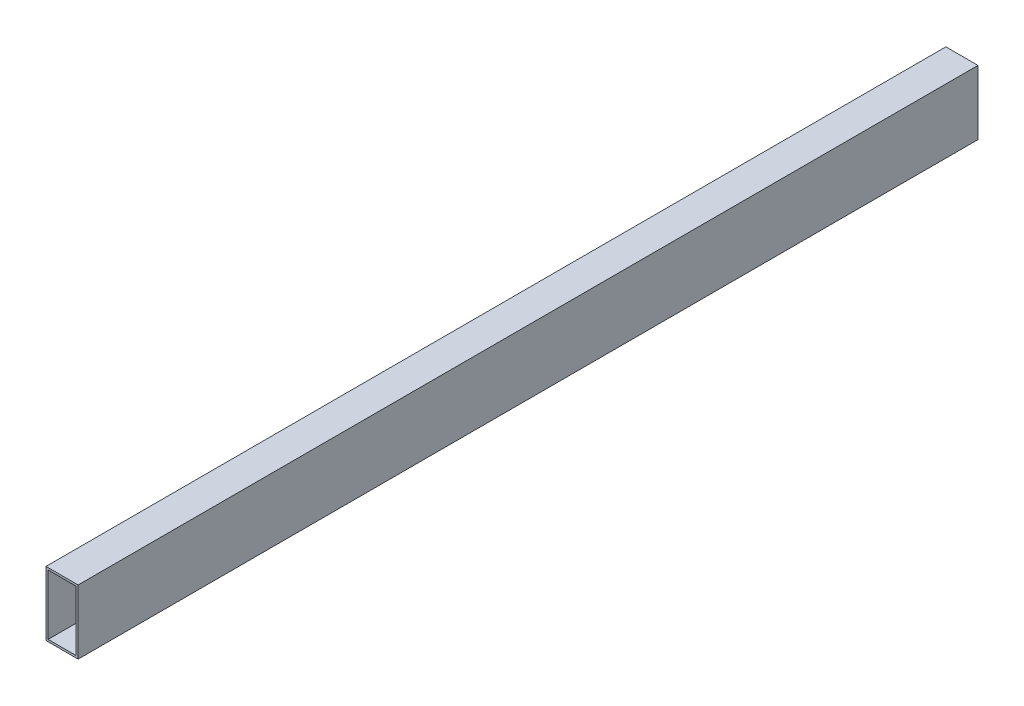
ISO-10303-21;
HEADER;
FILE_DESCRIPTION(('STEP AP214'),'2;1');
FILE_NAME('part.step','',(''),(''),'','','');
FILE_SCHEMA(('AUTOMOTIVE_DESIGN { 1 0 10303 214 1 1 1 1 }'));
ENDSEC;
DATA;
#1=APPLICATION_CONTEXT('core data for automotive mechanical design processes');
#2=APPLICATION_PROTOCOL_DEFINITION('international standard','automotive_design',2000,#1);
#3=PRODUCT_CONTEXT('',#1,'mechanical');
#4=PRODUCT('Part','Part','',(#3));
#5=PRODUCT_RELATED_PRODUCT_CATEGORY('part','',(#4));
#6=PRODUCT_DEFINITION_FORMATION('','',#4);
#7=PRODUCT_DEFINITION_CONTEXT('part definition',#1,'design');
#8=PRODUCT_DEFINITION('design','',#6,#7);
#9=PRODUCT_DEFINITION_SHAPE('','',#8);
#10=(LENGTH_UNIT() NAMED_UNIT(*) SI_UNIT(.MILLI.,.METRE.));
#11=(NAMED_UNIT(*) PLANE_ANGLE_UNIT() SI_UNIT($,.RADIAN.));
#12=(NAMED_UNIT(*) SI_UNIT($,.STERADIAN.) SOLID_ANGLE_UNIT());
#13=UNCERTAINTY_MEASURE_WITH_UNIT(LENGTH_MEASURE(1.E-05),#10,'distance_accuracy_value','');
#14=(GEOMETRIC_REPRESENTATION_CONTEXT(3) GLOBAL_UNCERTAINTY_ASSIGNED_CONTEXT((#13)) GLOBAL_UNIT_ASSIGNED_CONTEXT((#10,
#11,#12)) REPRESENTATION_CONTEXT('',''));
#15=CARTESIAN_POINT('',(0.,0.,0.));
#16=DIRECTION('',(0.,0.,1.));
#17=DIRECTION('',(1.,0.,0.));
#18=AXIS2_PLACEMENT_3D('',#15,#16,#17);
#19=CARTESIAN_POINT('',(-48.4372093023255,-30.1994186046511,711.2));
#20=DIRECTION('',(1.,0.,0.));
#21=DIRECTION('',(0.,0.,-1.));
#22=AXIS2_PLACEMENT_3D('',#19,#20,#21);
#23=PLANE('',#22);
#24=DIRECTION('',(0.,-1.,0.));
#25=VECTOR('',#24,1.);
#26=CARTESIAN_POINT('',(-48.4372093023255,-30.1994186046511,0.));
#27=LINE('',#26,#25);
#28=CARTESIAN_POINT('',(-48.4372093023255,20.6005813953489,0.));
#29=VERTEX_POINT('',#28);
#30=CARTESIAN_POINT('',(-48.4372093023255,-30.1994186046511,0.));
#31=VERTEX_POINT('',#30);
#32=EDGE_CURVE('E129',#29,#31,#27,.T.);
#33=ORIENTED_EDGE('',*,*,#32,.T.);
#34=DIRECTION('',(0.,0.,-1.));
#35=VECTOR('',#34,1.);
#36=CARTESIAN_POINT('',(-48.4372093023255,-30.1994186046511,711.2));
#37=LINE('',#36,#35);
#38=CARTESIAN_POINT('',(-48.4372093023255,-30.1994186046511,711.2));
#39=VERTEX_POINT('',#38);
#40=EDGE_CURVE('E11',#39,#31,#37,.T.);
#41=ORIENTED_EDGE('',*,*,#40,.F.);
#42=DIRECTION('',(0.,-1.,0.));
#43=VECTOR('',#42,1.);
#44=CARTESIAN_POINT('',(-48.4372093023255,-30.1994186046511,711.2));
#45=LINE('',#44,#43);
#46=CARTESIAN_POINT('',(-48.4372093023255,20.6005813953489,711.2));
#47=VERTEX_POINT('',#46);
#48=EDGE_CURVE('E133',#47,#39,#45,.T.);
#49=ORIENTED_EDGE('',*,*,#48,.F.);
#50=DIRECTION('',(0.,0.,-1.));
#51=VECTOR('',#50,1.);
#52=CARTESIAN_POINT('',(-48.4372093023255,20.6005813953489,711.2));
#53=LINE('',#52,#51);
#54=EDGE_CURVE('E143',#47,#29,#53,.T.);
#55=ORIENTED_EDGE('',*,*,#54,.T.);
#56=EDGE_LOOP('',(#33,#41,#49,#55));
#57=FACE_BOUND('',#56,.T.);
#58=ADVANCED_FACE('F32',(#57),#23,.F.);
#59=CARTESIAN_POINT('',(-48.4372093023255,-30.1994186046511,711.2));
#60=DIRECTION('',(0.,1.,0.));
#61=DIRECTION('',(0.,0.,1.));
#62=AXIS2_PLACEMENT_3D('',#59,#60,#61);
#63=PLANE('',#62);
#64=DIRECTION('',(1.,0.,0.));
#65=VECTOR('',#64,1.);
#66=CARTESIAN_POINT('',(-48.4372093023255,-30.1994186046511,0.));
#67=LINE('',#66,#65);
#68=CARTESIAN_POINT('',(-23.0372093023255,-30.1994186046511,0.));
#69=VERTEX_POINT('',#68);
#70=EDGE_CURVE('E146',#31,#69,#67,.T.);
#71=ORIENTED_EDGE('',*,*,#70,.T.);
#72=DIRECTION('',(0.,0.,-1.));
#73=VECTOR('',#72,1.);
#74=CARTESIAN_POINT('',(-23.0372093023255,-30.1994186046511,711.2));
#75=LINE('',#74,#73);
#76=CARTESIAN_POINT('',(-23.0372093023255,-30.1994186046511,711.2));
#77=VERTEX_POINT('',#76);
#78=EDGE_CURVE('E39',#77,#69,#75,.T.);
#79=ORIENTED_EDGE('',*,*,#78,.F.);
#80=DIRECTION('',(1.,0.,0.));
#81=VECTOR('',#80,1.);
#82=CARTESIAN_POINT('',(-48.4372093023255,-30.1994186046511,711.2));
#83=LINE('',#82,#81);
#84=EDGE_CURVE('E136',#39,#77,#83,.T.);
#85=ORIENTED_EDGE('',*,*,#84,.F.);
#86=ORIENTED_EDGE('',*,*,#40,.T.);
#87=EDGE_LOOP('',(#71,#79,#85,#86));
#88=FACE_BOUND('',#87,.T.);
#89=ADVANCED_FACE('F174',(#88),#63,.F.);
#90=CARTESIAN_POINT('',(-23.0372093023255,-30.1994186046511,711.2));
#91=DIRECTION('',(-1.,0.,0.));
#92=DIRECTION('',(0.,-1.,0.));
#93=AXIS2_PLACEMENT_3D('',#90,#91,#92);
#94=PLANE('',#93);
#95=DIRECTION('',(0.,1.,0.));
#96=VECTOR('',#95,1.);
#97=CARTESIAN_POINT('',(-23.0372093023255,-30.1994186046511,0.));
#98=LINE('',#97,#96);
#99=CARTESIAN_POINT('',(-23.0372093023255,20.6005813953489,0.));
#100=VERTEX_POINT('',#99);
#101=EDGE_CURVE('E148',#69,#100,#98,.T.);
#102=ORIENTED_EDGE('',*,*,#101,.T.);
#103=DIRECTION('',(0.,0.,-1.));
#104=VECTOR('',#103,1.);
#105=CARTESIAN_POINT('',(-23.0372093023255,20.6005813953489,711.2));
#106=LINE('',#105,#104);
#107=CARTESIAN_POINT('',(-23.0372093023255,20.6005813953489,711.2));
#108=VERTEX_POINT('',#107);
#109=EDGE_CURVE('E153',#108,#100,#106,.T.);
#110=ORIENTED_EDGE('',*,*,#109,.F.);
#111=DIRECTION('',(0.,1.,0.));
#112=VECTOR('',#111,1.);
#113=CARTESIAN_POINT('',(-23.0372093023255,-30.1994186046511,711.2));
#114=LINE('',#113,#112);
#115=EDGE_CURVE('E139',#77,#108,#114,.T.);
#116=ORIENTED_EDGE('',*,*,#115,.F.);
#117=ORIENTED_EDGE('',*,*,#78,.T.);
#118=EDGE_LOOP('',(#102,#110,#116,#117));
#119=FACE_BOUND('',#118,.T.);
#120=ADVANCED_FACE('F160',(#119),#94,.F.);
#121=CARTESIAN_POINT('',(-48.4372093023255,20.6005813953489,711.2));
#122=DIRECTION('',(0.,-1.,0.));
#123=DIRECTION('',(0.,0.,-1.));
#124=AXIS2_PLACEMENT_3D('',#121,#122,#123);
#125=PLANE('',#124);
#126=DIRECTION('',(-1.,0.,0.));
#127=VECTOR('',#126,1.);
#128=CARTESIAN_POINT('',(-48.4372093023255,20.6005813953489,0.));
#129=LINE('',#128,#127);
#130=EDGE_CURVE('E137',#100,#29,#129,.T.);
#131=ORIENTED_EDGE('',*,*,#130,.T.);
#132=ORIENTED_EDGE('',*,*,#54,.F.);
#133=DIRECTION('',(-1.,0.,0.));
#134=VECTOR('',#133,1.);
#135=CARTESIAN_POINT('',(-48.4372093023255,20.6005813953489,711.2));
#136=LINE('',#135,#134);
#137=EDGE_CURVE('E141',#108,#47,#136,.T.);
#138=ORIENTED_EDGE('',*,*,#137,.F.);
#139=ORIENTED_EDGE('',*,*,#109,.T.);
#140=EDGE_LOOP('',(#131,#132,#138,#139));
#141=FACE_BOUND('',#140,.T.);
#142=ADVANCED_FACE('F167',(#141),#125,.F.);
#143=CARTESIAN_POINT('',(0.,0.,711.2));
#144=DIRECTION('',(0.,0.,-1.));
#145=DIRECTION('',(-1.,0.,0.));
#146=AXIS2_PLACEMENT_3D('',#143,#144,#145);
#147=PLANE('',#146);
#148=DIRECTION('',(-1.,0.,0.));
#149=VECTOR('',#148,1.);
#150=CARTESIAN_POINT('',(-46.7862093023255,18.9495813953489,711.2));
#151=LINE('',#150,#149);
#152=CARTESIAN_POINT('',(-24.6882093023255,18.9495813953489,711.2));
#153=VERTEX_POINT('',#152);
#154=CARTESIAN_POINT('',(-46.7862093023255,18.9495813953489,711.2));
#155=VERTEX_POINT('',#154);
#156=EDGE_CURVE('E123',#153,#155,#151,.T.);
#157=ORIENTED_EDGE('',*,*,#156,.F.);
#158=DIRECTION('',(0.,1.,0.));
#159=VECTOR('',#158,1.);
#160=CARTESIAN_POINT('',(-24.6882093023255,18.9495813953489,711.2));
#161=LINE('',#160,#159);
#162=CARTESIAN_POINT('',(-24.6882093023255,-28.5484186046511,711.2));
#163=VERTEX_POINT('',#162);
#164=EDGE_CURVE('E46',#163,#153,#161,.T.);
#165=ORIENTED_EDGE('',*,*,#164,.F.);
#166=DIRECTION('',(1.,0.,0.));
#167=VECTOR('',#166,1.);
#168=CARTESIAN_POINT('',(-46.7862093023255,-28.5484186046511,711.2));
#169=LINE('',#168,#167);
#170=CARTESIAN_POINT('',(-46.7862093023255,-28.5484186046511,711.2));
#171=VERTEX_POINT('',#170);
#172=EDGE_CURVE('E114',#171,#163,#169,.T.);
#173=ORIENTED_EDGE('',*,*,#172,.F.);
#174=DIRECTION('',(0.,-1.,0.));
#175=VECTOR('',#174,1.);
#176=CARTESIAN_POINT('',(-46.7862093023255,18.9495813953489,711.2));
#177=LINE('',#176,#175);
#178=EDGE_CURVE('E117',#155,#171,#177,.T.);
#179=ORIENTED_EDGE('',*,*,#178,.F.);
#180=EDGE_LOOP('',(#157,#165,#173,#179));
#181=FACE_BOUND('',#180,.T.);
#182=ORIENTED_EDGE('',*,*,#48,.T.);
#183=ORIENTED_EDGE('',*,*,#84,.T.);
#184=ORIENTED_EDGE('',*,*,#115,.T.);
#185=ORIENTED_EDGE('',*,*,#137,.T.);
#186=EDGE_LOOP('',(#182,#183,#184,#185));
#187=FACE_BOUND('',#186,.T.);
#188=ADVANCED_FACE('F173',(#181,#187),#147,.F.);
#189=CARTESIAN_POINT('',(0.,0.,0.));
#190=DIRECTION('',(0.,0.,-1.));
#191=DIRECTION('',(-1.,0.,0.));
#192=AXIS2_PLACEMENT_3D('',#189,#190,#191);
#193=PLANE('',#192);
#194=DIRECTION('',(0.,1.,0.));
#195=VECTOR('',#194,1.);
#196=CARTESIAN_POINT('',(-24.6882093023255,18.9495813953489,0.));
#197=LINE('',#196,#195);
#198=CARTESIAN_POINT('',(-24.6882093023255,-28.5484186046511,0.));
#199=VERTEX_POINT('',#198);
#200=CARTESIAN_POINT('',(-24.6882093023255,18.9495813953489,0.));
#201=VERTEX_POINT('',#200);
#202=EDGE_CURVE('E98',#199,#201,#197,.T.);
#203=ORIENTED_EDGE('',*,*,#202,.T.);
#204=DIRECTION('',(-1.,0.,0.));
#205=VECTOR('',#204,1.);
#206=CARTESIAN_POINT('',(-46.7862093023255,18.9495813953489,0.));
#207=LINE('',#206,#205);
#208=CARTESIAN_POINT('',(-46.7862093023255,18.9495813953489,0.));
#209=VERTEX_POINT('',#208);
#210=EDGE_CURVE('E107',#201,#209,#207,.T.);
#211=ORIENTED_EDGE('',*,*,#210,.T.);
#212=DIRECTION('',(0.,-1.,0.));
#213=VECTOR('',#212,1.);
#214=CARTESIAN_POINT('',(-46.7862093023255,18.9495813953489,0.));
#215=LINE('',#214,#213);
#216=CARTESIAN_POINT('',(-46.7862093023255,-28.5484186046511,0.));
#217=VERTEX_POINT('',#216);
#218=EDGE_CURVE('E54',#209,#217,#215,.T.);
#219=ORIENTED_EDGE('',*,*,#218,.T.);
#220=DIRECTION('',(1.,0.,0.));
#221=VECTOR('',#220,1.);
#222=CARTESIAN_POINT('',(-46.7862093023255,-28.5484186046511,0.));
#223=LINE('',#222,#221);
#224=EDGE_CURVE('E104',#217,#199,#223,.T.);
#225=ORIENTED_EDGE('',*,*,#224,.T.);
#226=EDGE_LOOP('',(#203,#211,#219,#225));
#227=FACE_BOUND('',#226,.T.);
#228=ORIENTED_EDGE('',*,*,#32,.F.);
#229=ORIENTED_EDGE('',*,*,#130,.F.);
#230=ORIENTED_EDGE('',*,*,#101,.F.);
#231=ORIENTED_EDGE('',*,*,#70,.F.);
#232=EDGE_LOOP('',(#228,#229,#230,#231));
#233=FACE_BOUND('',#232,.T.);
#234=ADVANCED_FACE('F111',(#227,#233),#193,.T.);
#235=CARTESIAN_POINT('',(-24.6882093023255,18.9495813953489,0.));
#236=DIRECTION('',(1.,0.,0.));
#237=DIRECTION('',(0.,1.,0.));
#238=AXIS2_PLACEMENT_3D('',#235,#236,#237);
#239=PLANE('',#238);
#240=ORIENTED_EDGE('',*,*,#164,.T.);
#241=DIRECTION('',(0.,0.,1.));
#242=VECTOR('',#241,1.);
#243=CARTESIAN_POINT('',(-24.6882093023255,18.9495813953489,0.));
#244=LINE('',#243,#242);
#245=EDGE_CURVE('E94',#201,#153,#244,.T.);
#246=ORIENTED_EDGE('',*,*,#245,.F.);
#247=ORIENTED_EDGE('',*,*,#202,.F.);
#248=DIRECTION('',(0.,0.,1.));
#249=VECTOR('',#248,1.);
#250=CARTESIAN_POINT('',(-24.6882093023255,-28.5484186046511,0.));
#251=LINE('',#250,#249);
#252=EDGE_CURVE('E127',#199,#163,#251,.T.);
#253=ORIENTED_EDGE('',*,*,#252,.T.);
#254=EDGE_LOOP('',(#240,#246,#247,#253));
#255=FACE_BOUND('',#254,.T.);
#256=ADVANCED_FACE('F96',(#255),#239,.F.);
#257=CARTESIAN_POINT('',(-46.7862093023255,-28.5484186046511,0.));
#258=DIRECTION('',(0.,-1.,0.));
#259=DIRECTION('',(0.,0.,-1.));
#260=AXIS2_PLACEMENT_3D('',#257,#258,#259);
#261=PLANE('',#260);
#262=ORIENTED_EDGE('',*,*,#172,.T.);
#263=ORIENTED_EDGE('',*,*,#252,.F.);
#264=ORIENTED_EDGE('',*,*,#224,.F.);
#265=DIRECTION('',(0.,0.,1.));
#266=VECTOR('',#265,1.);
#267=CARTESIAN_POINT('',(-46.7862093023255,-28.5484186046511,0.));
#268=LINE('',#267,#266);
#269=EDGE_CURVE('E130',#217,#171,#268,.T.);
#270=ORIENTED_EDGE('',*,*,#269,.T.);
#271=EDGE_LOOP('',(#262,#263,#264,#270));
#272=FACE_BOUND('',#271,.T.);
#273=ADVANCED_FACE('F191',(#272),#261,.F.);
#274=CARTESIAN_POINT('',(-46.7862093023255,18.9495813953489,0.));
#275=DIRECTION('',(-1.,0.,0.));
#276=DIRECTION('',(0.,-1.,0.));
#277=AXIS2_PLACEMENT_3D('',#274,#275,#276);
#278=PLANE('',#277);
#279=ORIENTED_EDGE('',*,*,#178,.T.);
#280=ORIENTED_EDGE('',*,*,#269,.F.);
#281=ORIENTED_EDGE('',*,*,#218,.F.);
#282=DIRECTION('',(0.,0.,1.));
#283=VECTOR('',#282,1.);
#284=CARTESIAN_POINT('',(-46.7862093023255,18.9495813953489,0.));
#285=LINE('',#284,#283);
#286=EDGE_CURVE('E103',#209,#155,#285,.T.);
#287=ORIENTED_EDGE('',*,*,#286,.T.);
#288=EDGE_LOOP('',(#279,#280,#281,#287));
#289=FACE_BOUND('',#288,.T.);
#290=ADVANCED_FACE('F194',(#289),#278,.F.);
#291=CARTESIAN_POINT('',(-46.7862093023255,18.9495813953489,0.));
#292=DIRECTION('',(0.,1.,0.));
#293=DIRECTION('',(0.,0.,1.));
#294=AXIS2_PLACEMENT_3D('',#291,#292,#293);
#295=PLANE('',#294);
#296=ORIENTED_EDGE('',*,*,#156,.T.);
#297=ORIENTED_EDGE('',*,*,#286,.F.);
#298=ORIENTED_EDGE('',*,*,#210,.F.);
#299=ORIENTED_EDGE('',*,*,#245,.T.);
#300=EDGE_LOOP('',(#296,#297,#298,#299));
#301=FACE_BOUND('',#300,.T.);
#302=ADVANCED_FACE('F108',(#301),#295,.F.);
#303=CLOSED_SHELL('',(#58,#89,#120,#142,#188,#234,#256,#273,#290,#302));
#304=MANIFOLD_SOLID_BREP('B2',#303);
#305=ADVANCED_BREP_SHAPE_REPRESENTATION('',(#18,#304),#14);
#306=SHAPE_DEFINITION_REPRESENTATION(#9,#305);
ENDSEC;
END-ISO-10303-21;
